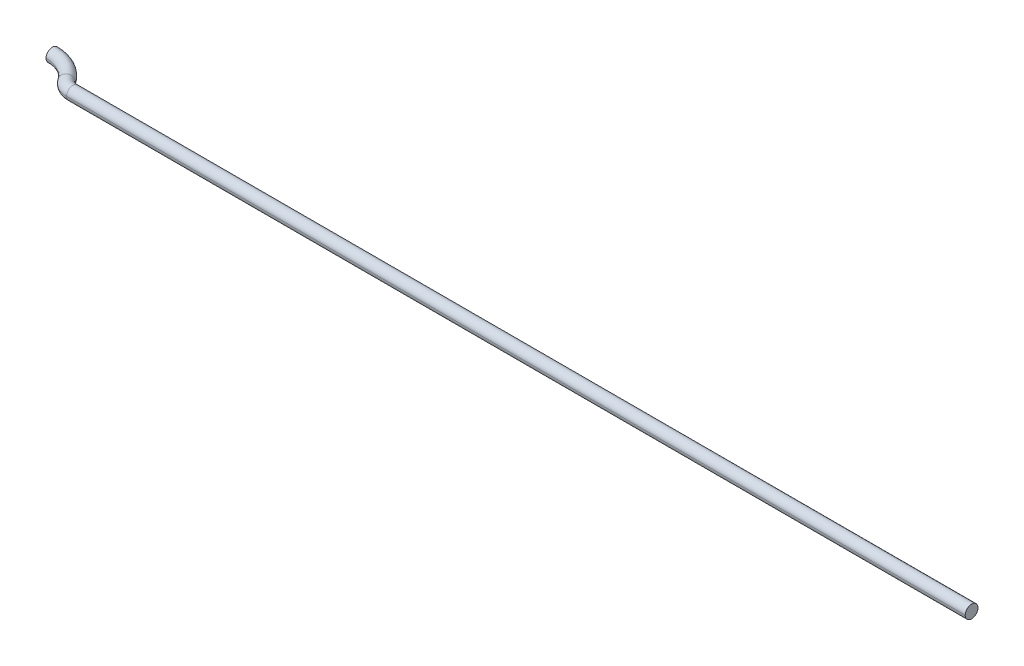
ISO-10303-21;
HEADER;
FILE_DESCRIPTION(('STEP AP214'),'2;1');
FILE_NAME('part.step','',(''),(''),'','','');
FILE_SCHEMA(('AUTOMOTIVE_DESIGN { 1 0 10303 214 1 1 1 1 }'));
ENDSEC;
DATA;
#1=APPLICATION_CONTEXT('core data for automotive mechanical design processes');
#2=APPLICATION_PROTOCOL_DEFINITION('international standard','automotive_design',2000,#1);
#3=PRODUCT_CONTEXT('',#1,'mechanical');
#4=PRODUCT('Part','Part','',(#3));
#5=PRODUCT_RELATED_PRODUCT_CATEGORY('part','',(#4));
#6=PRODUCT_DEFINITION_FORMATION('','',#4);
#7=PRODUCT_DEFINITION_CONTEXT('part definition',#1,'design');
#8=PRODUCT_DEFINITION('design','',#6,#7);
#9=PRODUCT_DEFINITION_SHAPE('','',#8);
#10=(LENGTH_UNIT() NAMED_UNIT(*) SI_UNIT(.MILLI.,.METRE.));
#11=(NAMED_UNIT(*) PLANE_ANGLE_UNIT() SI_UNIT($,.RADIAN.));
#12=(NAMED_UNIT(*) SI_UNIT($,.STERADIAN.) SOLID_ANGLE_UNIT());
#13=UNCERTAINTY_MEASURE_WITH_UNIT(LENGTH_MEASURE(1.E-05),#10,'distance_accuracy_value','');
#14=(GEOMETRIC_REPRESENTATION_CONTEXT(3) GLOBAL_UNCERTAINTY_ASSIGNED_CONTEXT((#13)) GLOBAL_UNIT_ASSIGNED_CONTEXT((#10,
#11,#12)) REPRESENTATION_CONTEXT('',''));
#15=CARTESIAN_POINT('',(0.,0.,0.));
#16=DIRECTION('',(0.,0.,1.));
#17=DIRECTION('',(1.,0.,0.));
#18=AXIS2_PLACEMENT_3D('',#15,#16,#17);
#19=CARTESIAN_POINT('',(316.318408416184,0.,-4.99999999999986));
#20=DIRECTION('',(1.,0.,0.));
#21=DIRECTION('',(0.,0.,1.));
#22=AXIS2_PLACEMENT_3D('',#19,#20,#21);
#23=PLANE('',#22);
#24=CARTESIAN_POINT('',(316.318408416184,0.,-4.99999999999986));
#25=DIRECTION('',(1.,0.,0.));
#26=DIRECTION('',(0.,0.,-1.));
#27=AXIS2_PLACEMENT_3D('',#24,#25,#26);
#28=CIRCLE('',#27,2.25);
#29=CARTESIAN_POINT('',(316.318408416184,0.,-2.74999999999985));
#30=VERTEX_POINT('',#29);
#31=CARTESIAN_POINT('',(316.318408416184,0.,-7.24999999999986));
#32=VERTEX_POINT('',#31);
#33=EDGE_CURVE('E11',#30,#32,#28,.T.);
#34=ORIENTED_EDGE('',*,*,#33,.T.);
#35=CARTESIAN_POINT('',(316.318408416184,0.,-4.99999999999986));
#36=DIRECTION('',(1.,0.,0.));
#37=DIRECTION('',(0.,0.,-1.));
#38=AXIS2_PLACEMENT_3D('',#35,#36,#37);
#39=CIRCLE('',#38,2.25);
#40=EDGE_CURVE('E89',#32,#30,#39,.T.);
#41=ORIENTED_EDGE('',*,*,#40,.T.);
#42=EDGE_LOOP('',(#34,#41));
#43=FACE_BOUND('',#42,.T.);
#44=ADVANCED_FACE('F17',(#43),#23,.T.);
#45=CARTESIAN_POINT('',(-15.2315462117278,0.,-13.));
#46=DIRECTION('',(1.,0.,0.));
#47=DIRECTION('',(0.,0.,1.));
#48=AXIS2_PLACEMENT_3D('',#45,#46,#47);
#49=PLANE('',#48);
#50=CARTESIAN_POINT('',(-15.2315462117278,0.,-13.));
#51=DIRECTION('',(1.,0.,0.));
#52=DIRECTION('',(0.,0.,-1.));
#53=AXIS2_PLACEMENT_3D('',#50,#51,#52);
#54=CIRCLE('',#53,2.25);
#55=CARTESIAN_POINT('',(-15.2315462117278,0.,-10.75));
#56=VERTEX_POINT('',#55);
#57=CARTESIAN_POINT('',(-15.2315462117278,0.,-15.25));
#58=VERTEX_POINT('',#57);
#59=EDGE_CURVE('E27',#56,#58,#54,.T.);
#60=ORIENTED_EDGE('',*,*,#59,.F.);
#61=CARTESIAN_POINT('',(-15.2315462117278,0.,-13.));
#62=DIRECTION('',(1.,0.,0.));
#63=DIRECTION('',(0.,0.,-1.));
#64=AXIS2_PLACEMENT_3D('',#61,#62,#63);
#65=CIRCLE('',#64,2.25);
#66=EDGE_CURVE('E106',#58,#56,#65,.T.);
#67=ORIENTED_EDGE('',*,*,#66,.F.);
#68=EDGE_LOOP('',(#60,#67));
#69=FACE_BOUND('',#68,.T.);
#70=ADVANCED_FACE('F144',(#69),#49,.F.);
#71=CARTESIAN_POINT('',(62.318408416184,0.,-5.));
#72=DIRECTION('',(-1.,0.,0.));
#73=DIRECTION('',(0.,0.,1.));
#74=AXIS2_PLACEMENT_3D('',#71,#72,#73);
#75=CYLINDRICAL_SURFACE('',#74,2.25);
#76=DIRECTION('',(-1.,0.,0.));
#77=VECTOR('',#76,1.);
#78=CARTESIAN_POINT('',(62.318408416184,0.,-7.25));
#79=LINE('',#78,#77);
#80=CARTESIAN_POINT('',(0.,0.,-7.25));
#81=VERTEX_POINT('',#80);
#82=EDGE_CURVE('E128',#32,#81,#79,.T.);
#83=ORIENTED_EDGE('',*,*,#82,.F.);
#84=ORIENTED_EDGE('',*,*,#33,.F.);
#85=DIRECTION('',(-1.,0.,0.));
#86=VECTOR('',#85,1.);
#87=CARTESIAN_POINT('',(62.318408416184,0.,-2.75));
#88=LINE('',#87,#86);
#89=CARTESIAN_POINT('',(0.,0.,-2.75));
#90=VERTEX_POINT('',#89);
#91=EDGE_CURVE('E59',#30,#90,#88,.T.);
#92=ORIENTED_EDGE('',*,*,#91,.T.);
#93=CARTESIAN_POINT('',(0.,0.,-5.));
#94=DIRECTION('',(1.,0.,0.));
#95=DIRECTION('',(0.,0.,-1.));
#96=AXIS2_PLACEMENT_3D('',#93,#94,#95);
#97=CIRCLE('',#96,2.25);
#98=EDGE_CURVE('E119',#90,#81,#97,.T.);
#99=ORIENTED_EDGE('',*,*,#98,.T.);
#100=EDGE_LOOP('',(#83,#84,#92,#99));
#101=FACE_BOUND('',#100,.T.);
#102=ADVANCED_FACE('F141',(#101),#75,.T.);
#103=CARTESIAN_POINT('',(0.,0.,-10.5));
#104=DIRECTION('',(0.,-1.,0.));
#105=DIRECTION('',(0.,0.,-1.));
#106=AXIS2_PLACEMENT_3D('',#103,#104,#105);
#107=TOROIDAL_SURFACE('',#106,5.5,2.25);
#108=CARTESIAN_POINT('',(0.,0.,-10.5));
#109=DIRECTION('',(0.,-1.,0.));
#110=DIRECTION('',(0.,0.,-1.));
#111=AXIS2_PLACEMENT_3D('',#108,#109,#110);
#112=CIRCLE('',#111,7.75);
#113=CARTESIAN_POINT('',(-6.38078287248057,0.,-6.10135135135135));
#114=VERTEX_POINT('',#113);
#115=EDGE_CURVE('E95',#90,#114,#112,.T.);
#116=ORIENTED_EDGE('',*,*,#115,.F.);
#117=CARTESIAN_POINT('',(0.,0.,-5.));
#118=DIRECTION('',(1.,0.,0.));
#119=DIRECTION('',(0.,0.,-1.));
#120=AXIS2_PLACEMENT_3D('',#117,#118,#119);
#121=CIRCLE('',#120,2.25);
#122=EDGE_CURVE('E20',#81,#90,#121,.T.);
#123=ORIENTED_EDGE('',*,*,#122,.F.);
#124=CARTESIAN_POINT('',(0.,0.,-10.5));
#125=DIRECTION('',(0.,-1.,0.));
#126=DIRECTION('',(0.,0.,-1.));
#127=AXIS2_PLACEMENT_3D('',#124,#125,#126);
#128=CIRCLE('',#127,3.25);
#129=CARTESIAN_POINT('',(-2.67581217233056,0.,-8.65540540540541));
#130=VERTEX_POINT('',#129);
#131=EDGE_CURVE('E81',#81,#130,#128,.T.);
#132=ORIENTED_EDGE('',*,*,#131,.T.);
#133=CARTESIAN_POINT('',(-4.52829752240557,0.,-7.37837837837838));
#134=DIRECTION('',(0.567567567567567,0.,0.823326822255558));
#135=DIRECTION('',(0.823326822255558,0.,-0.567567567567567));
#136=AXIS2_PLACEMENT_3D('',#133,#134,#135);
#137=CIRCLE('',#136,2.25);
#138=EDGE_CURVE('E85',#130,#114,#137,.T.);
#139=ORIENTED_EDGE('',*,*,#138,.T.);
#140=EDGE_LOOP('',(#116,#123,#132,#139));
#141=FACE_BOUND('',#140,.T.);
#142=ADVANCED_FACE('F83',(#141),#107,.T.);
#143=CARTESIAN_POINT('',(-15.2315462117278,0.,0.));
#144=DIRECTION('',(0.,1.,0.));
#145=DIRECTION('',(0.,0.,1.));
#146=AXIS2_PLACEMENT_3D('',#143,#144,#145);
#147=TOROIDAL_SURFACE('',#146,13.,2.25);
#148=CARTESIAN_POINT('',(-15.2315462117278,0.,0.));
#149=DIRECTION('',(0.,1.,0.));
#150=DIRECTION('',(0.,0.,1.));
#151=AXIS2_PLACEMENT_3D('',#148,#149,#150);
#152=CIRCLE('',#151,15.25);
#153=EDGE_CURVE('E101',#130,#58,#152,.T.);
#154=ORIENTED_EDGE('',*,*,#153,.F.);
#155=CARTESIAN_POINT('',(-4.52829752240557,0.,-7.37837837837838));
#156=DIRECTION('',(0.567567567567567,0.,0.823326822255558));
#157=DIRECTION('',(0.823326822255558,0.,-0.567567567567567));
#158=AXIS2_PLACEMENT_3D('',#155,#156,#157);
#159=CIRCLE('',#158,2.25);
#160=EDGE_CURVE('E90',#114,#130,#159,.T.);
#161=ORIENTED_EDGE('',*,*,#160,.F.);
#162=CARTESIAN_POINT('',(-15.2315462117278,0.,0.));
#163=DIRECTION('',(0.,1.,0.));
#164=DIRECTION('',(0.,0.,1.));
#165=AXIS2_PLACEMENT_3D('',#162,#163,#164);
#166=CIRCLE('',#165,10.75);
#167=EDGE_CURVE('E109',#114,#56,#166,.T.);
#168=ORIENTED_EDGE('',*,*,#167,.T.);
#169=ORIENTED_EDGE('',*,*,#59,.T.);
#170=EDGE_LOOP('',(#154,#161,#168,#169));
#171=FACE_BOUND('',#170,.T.);
#172=ADVANCED_FACE('F102',(#171),#147,.T.);
#173=CARTESIAN_POINT('',(62.318408416184,0.,-5.));
#174=DIRECTION('',(-1.,0.,0.));
#175=DIRECTION('',(0.,0.,1.));
#176=AXIS2_PLACEMENT_3D('',#173,#174,#175);
#177=CYLINDRICAL_SURFACE('',#176,2.25);
#178=ORIENTED_EDGE('',*,*,#40,.F.);
#179=ORIENTED_EDGE('',*,*,#82,.T.);
#180=ORIENTED_EDGE('',*,*,#122,.T.);
#181=ORIENTED_EDGE('',*,*,#91,.F.);
#182=EDGE_LOOP('',(#178,#179,#180,#181));
#183=FACE_BOUND('',#182,.T.);
#184=ADVANCED_FACE('F140',(#183),#177,.T.);
#185=CARTESIAN_POINT('',(0.,0.,-10.5));
#186=DIRECTION('',(0.,-1.,0.));
#187=DIRECTION('',(0.,0.,-1.));
#188=AXIS2_PLACEMENT_3D('',#185,#186,#187);
#189=TOROIDAL_SURFACE('',#188,5.5,2.25);
#190=ORIENTED_EDGE('',*,*,#98,.F.);
#191=ORIENTED_EDGE('',*,*,#115,.T.);
#192=ORIENTED_EDGE('',*,*,#160,.T.);
#193=ORIENTED_EDGE('',*,*,#131,.F.);
#194=EDGE_LOOP('',(#190,#191,#192,#193));
#195=FACE_BOUND('',#194,.T.);
#196=ADVANCED_FACE('F94',(#195),#189,.T.);
#197=CARTESIAN_POINT('',(-15.2315462117278,0.,0.));
#198=DIRECTION('',(0.,1.,0.));
#199=DIRECTION('',(0.,0.,1.));
#200=AXIS2_PLACEMENT_3D('',#197,#198,#199);
#201=TOROIDAL_SURFACE('',#200,13.,2.25);
#202=ORIENTED_EDGE('',*,*,#138,.F.);
#203=ORIENTED_EDGE('',*,*,#153,.T.);
#204=ORIENTED_EDGE('',*,*,#66,.T.);
#205=ORIENTED_EDGE('',*,*,#167,.F.);
#206=EDGE_LOOP('',(#202,#203,#204,#205));
#207=FACE_BOUND('',#206,.T.);
#208=ADVANCED_FACE('F108',(#207),#201,.T.);
#209=CLOSED_SHELL('',(#44,#70,#102,#142,#172,#184,#196,#208));
#210=MANIFOLD_SOLID_BREP('B1',#209);
#211=ADVANCED_BREP_SHAPE_REPRESENTATION('',(#18,#210),#14);
#212=SHAPE_DEFINITION_REPRESENTATION(#9,#211);
ENDSEC;
END-ISO-10303-21;
